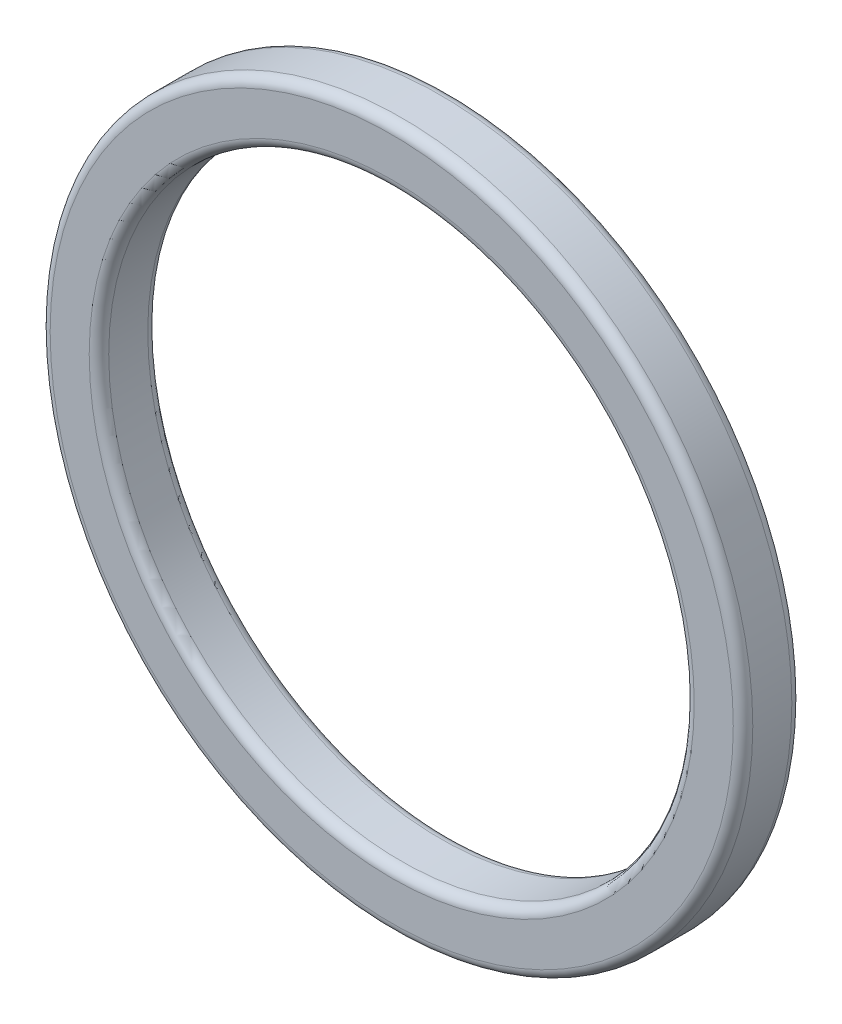
ISO-10303-21;
HEADER;
FILE_DESCRIPTION(('STEP AP214'),'2;1');
FILE_NAME('part.step','',(''),(''),'','','');
FILE_SCHEMA(('AUTOMOTIVE_DESIGN { 1 0 10303 214 1 1 1 1 }'));
ENDSEC;
DATA;
#1=APPLICATION_CONTEXT('core data for automotive mechanical design processes');
#2=APPLICATION_PROTOCOL_DEFINITION('international standard','automotive_design',2000,#1);
#3=PRODUCT_CONTEXT('',#1,'mechanical');
#4=PRODUCT('Part','Part','',(#3));
#5=PRODUCT_RELATED_PRODUCT_CATEGORY('part','',(#4));
#6=PRODUCT_DEFINITION_FORMATION('','',#4);
#7=PRODUCT_DEFINITION_CONTEXT('part definition',#1,'design');
#8=PRODUCT_DEFINITION('design','',#6,#7);
#9=PRODUCT_DEFINITION_SHAPE('','',#8);
#10=(LENGTH_UNIT() NAMED_UNIT(*) SI_UNIT(.MILLI.,.METRE.));
#11=(NAMED_UNIT(*) PLANE_ANGLE_UNIT() SI_UNIT($,.RADIAN.));
#12=(NAMED_UNIT(*) SI_UNIT($,.STERADIAN.) SOLID_ANGLE_UNIT());
#13=UNCERTAINTY_MEASURE_WITH_UNIT(LENGTH_MEASURE(1.E-05),#10,'distance_accuracy_value','');
#14=(GEOMETRIC_REPRESENTATION_CONTEXT(3) GLOBAL_UNCERTAINTY_ASSIGNED_CONTEXT((#13)) GLOBAL_UNIT_ASSIGNED_CONTEXT((#10,
#11,#12)) REPRESENTATION_CONTEXT('',''));
#15=CARTESIAN_POINT('',(0.,0.,0.));
#16=DIRECTION('',(0.,0.,1.));
#17=DIRECTION('',(1.,0.,0.));
#18=AXIS2_PLACEMENT_3D('',#15,#16,#17);
#19=CARTESIAN_POINT('',(0.,0.,0.));
#20=DIRECTION('',(0.,0.,1.));
#21=DIRECTION('',(1.,0.,0.));
#22=AXIS2_PLACEMENT_3D('',#19,#20,#21);
#23=CYLINDRICAL_SURFACE('',#22,15.);
#24=CARTESIAN_POINT('',(0.,0.,1.));
#25=DIRECTION('',(0.,0.,1.));
#26=DIRECTION('',(1.,0.,0.));
#27=AXIS2_PLACEMENT_3D('',#24,#25,#26);
#28=CIRCLE('',#27,15.);
#29=CARTESIAN_POINT('',(15.,0.,1.));
#30=VERTEX_POINT('',#29);
#31=EDGE_CURVE('E108',#30,#30,#28,.F.);
#32=ORIENTED_EDGE('',*,*,#31,.F.);
#33=EDGE_LOOP('',(#32));
#34=FACE_BOUND('',#33,.T.);
#35=CARTESIAN_POINT('',(0.,0.,-1.));
#36=DIRECTION('',(0.,0.,1.));
#37=DIRECTION('',(1.,0.,0.));
#38=AXIS2_PLACEMENT_3D('',#35,#36,#37);
#39=CIRCLE('',#38,15.);
#40=CARTESIAN_POINT('',(15.,0.,-1.));
#41=VERTEX_POINT('',#40);
#42=EDGE_CURVE('E112',#41,#41,#39,.T.);
#43=ORIENTED_EDGE('',*,*,#42,.F.);
#44=EDGE_LOOP('',(#43));
#45=FACE_BOUND('',#44,.T.);
#46=ADVANCED_FACE('F15',(#34,#45),#23,.F.);
#47=CARTESIAN_POINT('',(0.,0.,-1.));
#48=DIRECTION('',(0.,0.,1.));
#49=DIRECTION('',(1.,0.,0.));
#50=AXIS2_PLACEMENT_3D('',#47,#48,#49);
#51=TOROIDAL_SURFACE('',#50,15.5,0.5);
#52=ORIENTED_EDGE('',*,*,#42,.T.);
#53=EDGE_LOOP('',(#52));
#54=FACE_BOUND('',#53,.T.);
#55=CARTESIAN_POINT('',(0.,0.,-1.5));
#56=DIRECTION('',(0.,0.,-1.));
#57=DIRECTION('',(-1.,-1.78330484480248E-08,0.));
#58=AXIS2_PLACEMENT_3D('',#55,#56,#57);
#59=CIRCLE('',#58,15.5);
#60=CARTESIAN_POINT('',(-15.5,-2.76412253608919E-07,-1.5));
#61=VERTEX_POINT('',#60);
#62=EDGE_CURVE('E111',#61,#61,#59,.T.);
#63=ORIENTED_EDGE('',*,*,#62,.T.);
#64=EDGE_LOOP('',(#63));
#65=FACE_BOUND('',#64,.T.);
#66=ADVANCED_FACE('F131',(#54,#65),#51,.T.);
#67=CARTESIAN_POINT('',(0.,0.,1.));
#68=DIRECTION('',(0.,0.,1.));
#69=DIRECTION('',(1.,0.,0.));
#70=AXIS2_PLACEMENT_3D('',#67,#68,#69);
#71=TOROIDAL_SURFACE('',#70,15.5,0.5);
#72=CARTESIAN_POINT('',(0.,0.,1.5));
#73=DIRECTION('',(0.,0.,1.));
#74=DIRECTION('',(-1.,1.16201050007829E-08,0.));
#75=AXIS2_PLACEMENT_3D('',#72,#73,#74);
#76=CIRCLE('',#75,15.5);
#77=CARTESIAN_POINT('',(-15.5,1.80111629288492E-07,1.5));
#78=VERTEX_POINT('',#77);
#79=EDGE_CURVE('E119',#78,#78,#76,.F.);
#80=ORIENTED_EDGE('',*,*,#79,.F.);
#81=EDGE_LOOP('',(#80));
#82=FACE_BOUND('',#81,.T.);
#83=ORIENTED_EDGE('',*,*,#31,.T.);
#84=EDGE_LOOP('',(#83));
#85=FACE_BOUND('',#84,.T.);
#86=ADVANCED_FACE('F83',(#82,#85),#71,.T.);
#87=CARTESIAN_POINT('',(0.,0.,-1.5));
#88=DIRECTION('',(0.,0.,1.));
#89=DIRECTION('',(1.,0.,0.));
#90=AXIS2_PLACEMENT_3D('',#87,#88,#89);
#91=PLANE('',#90);
#92=ORIENTED_EDGE('',*,*,#62,.F.);
#93=EDGE_LOOP('',(#92));
#94=FACE_BOUND('',#93,.T.);
#95=CARTESIAN_POINT('',(0.,0.,-1.5));
#96=DIRECTION('',(0.,0.,1.));
#97=DIRECTION('',(-1.,-1.10453989254203E-09,0.));
#98=AXIS2_PLACEMENT_3D('',#95,#96,#97);
#99=CIRCLE('',#98,17.5);
#100=CARTESIAN_POINT('',(-17.5,-1.93294410140585E-08,-1.5));
#101=VERTEX_POINT('',#100);
#102=EDGE_CURVE('E66',#101,#101,#99,.T.);
#103=ORIENTED_EDGE('',*,*,#102,.F.);
#104=EDGE_LOOP('',(#103));
#105=FACE_BOUND('',#104,.T.);
#106=ADVANCED_FACE('F73',(#94,#105),#91,.F.);
#107=CARTESIAN_POINT('',(0.,0.,1.5));
#108=DIRECTION('',(0.,0.,1.));
#109=DIRECTION('',(1.,0.,0.));
#110=AXIS2_PLACEMENT_3D('',#107,#108,#109);
#111=PLANE('',#110);
#112=ORIENTED_EDGE('',*,*,#79,.T.);
#113=EDGE_LOOP('',(#112));
#114=FACE_BOUND('',#113,.T.);
#115=CARTESIAN_POINT('',(0.,0.,1.5));
#116=DIRECTION('',(0.,0.,-1.));
#117=DIRECTION('',(-1.,2.45468926398555E-09,0.));
#118=AXIS2_PLACEMENT_3D('',#115,#116,#117);
#119=CIRCLE('',#118,17.5);
#120=CARTESIAN_POINT('',(-17.5,4.2957056790676E-08,1.5));
#121=VERTEX_POINT('',#120);
#122=EDGE_CURVE('E28',#121,#121,#119,.T.);
#123=ORIENTED_EDGE('',*,*,#122,.F.);
#124=EDGE_LOOP('',(#123));
#125=FACE_BOUND('',#124,.T.);
#126=ADVANCED_FACE('F82',(#114,#125),#111,.T.);
#127=CARTESIAN_POINT('',(0.,0.,-1.));
#128=DIRECTION('',(0.,0.,1.));
#129=DIRECTION('',(1.,0.,0.));
#130=AXIS2_PLACEMENT_3D('',#127,#128,#129);
#131=TOROIDAL_SURFACE('',#130,17.5,0.5);
#132=ORIENTED_EDGE('',*,*,#102,.T.);
#133=EDGE_LOOP('',(#132));
#134=FACE_BOUND('',#133,.T.);
#135=CARTESIAN_POINT('',(0.,0.,-1.));
#136=DIRECTION('',(0.,0.,1.));
#137=DIRECTION('',(1.,0.,0.));
#138=AXIS2_PLACEMENT_3D('',#135,#136,#137);
#139=CIRCLE('',#138,18.);
#140=CARTESIAN_POINT('',(18.,0.,-1.));
#141=VERTEX_POINT('',#140);
#142=EDGE_CURVE('E23',#141,#141,#139,.T.);
#143=ORIENTED_EDGE('',*,*,#142,.F.);
#144=EDGE_LOOP('',(#143));
#145=FACE_BOUND('',#144,.T.);
#146=ADVANCED_FACE('F46',(#134,#145),#131,.T.);
#147=CARTESIAN_POINT('',(0.,0.,1.));
#148=DIRECTION('',(0.,0.,1.));
#149=DIRECTION('',(1.,0.,0.));
#150=AXIS2_PLACEMENT_3D('',#147,#148,#149);
#151=TOROIDAL_SURFACE('',#150,17.5,0.5);
#152=CARTESIAN_POINT('',(0.,0.,1.));
#153=DIRECTION('',(0.,0.,1.));
#154=DIRECTION('',(1.,0.,0.));
#155=AXIS2_PLACEMENT_3D('',#152,#153,#154);
#156=CIRCLE('',#155,18.);
#157=CARTESIAN_POINT('',(18.,0.,1.));
#158=VERTEX_POINT('',#157);
#159=EDGE_CURVE('E10',#158,#158,#156,.F.);
#160=ORIENTED_EDGE('',*,*,#159,.F.);
#161=EDGE_LOOP('',(#160));
#162=FACE_BOUND('',#161,.T.);
#163=ORIENTED_EDGE('',*,*,#122,.T.);
#164=EDGE_LOOP('',(#163));
#165=FACE_BOUND('',#164,.T.);
#166=ADVANCED_FACE('F40',(#162,#165),#151,.T.);
#167=CARTESIAN_POINT('',(0.,0.,0.));
#168=DIRECTION('',(0.,0.,1.));
#169=DIRECTION('',(1.,0.,0.));
#170=AXIS2_PLACEMENT_3D('',#167,#168,#169);
#171=CYLINDRICAL_SURFACE('',#170,18.);
#172=ORIENTED_EDGE('',*,*,#159,.T.);
#173=EDGE_LOOP('',(#172));
#174=FACE_BOUND('',#173,.T.);
#175=ORIENTED_EDGE('',*,*,#142,.T.);
#176=EDGE_LOOP('',(#175));
#177=FACE_BOUND('',#176,.T.);
#178=ADVANCED_FACE('F45',(#174,#177),#171,.T.);
#179=CLOSED_SHELL('',(#46,#66,#86,#106,#126,#146,#166,#178));
#180=MANIFOLD_SOLID_BREP('B1',#179);
#181=ADVANCED_BREP_SHAPE_REPRESENTATION('',(#18,#180),#14);
#182=SHAPE_DEFINITION_REPRESENTATION(#9,#181);
ENDSEC;
END-ISO-10303-21;
